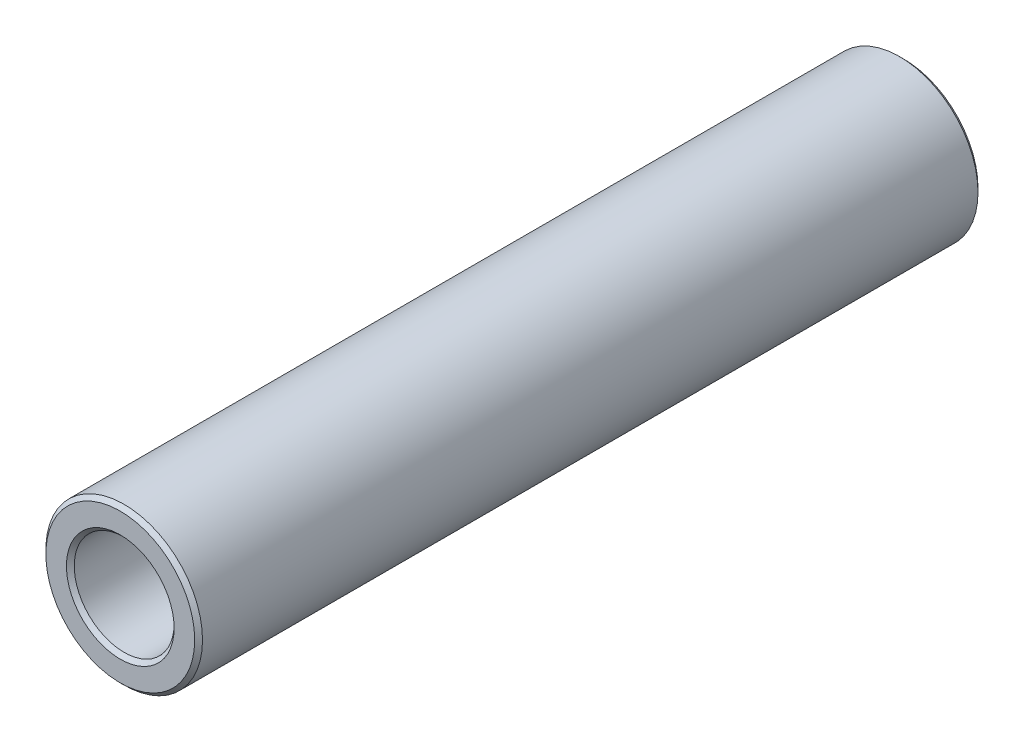
ISO-10303-21;
HEADER;
FILE_DESCRIPTION(('STEP AP214'),'2;1');
FILE_NAME('part.step','',(''),(''),'','','');
FILE_SCHEMA(('AUTOMOTIVE_DESIGN { 1 0 10303 214 1 1 1 1 }'));
ENDSEC;
DATA;
#1=APPLICATION_CONTEXT('core data for automotive mechanical design processes');
#2=APPLICATION_PROTOCOL_DEFINITION('international standard','automotive_design',2000,#1);
#3=PRODUCT_CONTEXT('',#1,'mechanical');
#4=PRODUCT('Part','Part','',(#3));
#5=PRODUCT_RELATED_PRODUCT_CATEGORY('part','',(#4));
#6=PRODUCT_DEFINITION_FORMATION('','',#4);
#7=PRODUCT_DEFINITION_CONTEXT('part definition',#1,'design');
#8=PRODUCT_DEFINITION('design','',#6,#7);
#9=PRODUCT_DEFINITION_SHAPE('','',#8);
#10=(LENGTH_UNIT() NAMED_UNIT(*) SI_UNIT(.MILLI.,.METRE.));
#11=(NAMED_UNIT(*) PLANE_ANGLE_UNIT() SI_UNIT($,.RADIAN.));
#12=(NAMED_UNIT(*) SI_UNIT($,.STERADIAN.) SOLID_ANGLE_UNIT());
#13=UNCERTAINTY_MEASURE_WITH_UNIT(LENGTH_MEASURE(1.E-05),#10,'distance_accuracy_value','');
#14=(GEOMETRIC_REPRESENTATION_CONTEXT(3) GLOBAL_UNCERTAINTY_ASSIGNED_CONTEXT((#13)) GLOBAL_UNIT_ASSIGNED_CONTEXT((#10,
#11,#12)) REPRESENTATION_CONTEXT('',''));
#15=CARTESIAN_POINT('',(0.,0.,0.));
#16=DIRECTION('',(0.,0.,1.));
#17=DIRECTION('',(1.,0.,0.));
#18=AXIS2_PLACEMENT_3D('',#15,#16,#17);
#19=CARTESIAN_POINT('',(0.,0.,40.));
#20=DIRECTION('',(0.,0.,1.));
#21=DIRECTION('',(1.,0.,0.));
#22=AXIS2_PLACEMENT_3D('',#19,#20,#21);
#23=PLANE('',#22);
#24=CARTESIAN_POINT('',(0.,0.,40.));
#25=DIRECTION('',(0.,0.,1.));
#26=DIRECTION('',(1.,0.,0.));
#27=AXIS2_PLACEMENT_3D('',#24,#25,#26);
#28=CIRCLE('',#27,2.75);
#29=CARTESIAN_POINT('',(2.75,0.,40.));
#30=VERTEX_POINT('',#29);
#31=EDGE_CURVE('E10',#30,#30,#28,.F.);
#32=ORIENTED_EDGE('',*,*,#31,.T.);
#33=EDGE_LOOP('',(#32));
#34=FACE_BOUND('',#33,.T.);
#35=CARTESIAN_POINT('',(0.,0.,40.));
#36=DIRECTION('',(0.,0.,1.));
#37=DIRECTION('',(1.,0.,0.));
#38=AXIS2_PLACEMENT_3D('',#35,#36,#37);
#39=CIRCLE('',#38,3.8);
#40=CARTESIAN_POINT('',(3.8,0.,40.));
#41=VERTEX_POINT('',#40);
#42=EDGE_CURVE('E44',#41,#41,#39,.T.);
#43=ORIENTED_EDGE('',*,*,#42,.T.);
#44=EDGE_LOOP('',(#43));
#45=FACE_BOUND('',#44,.T.);
#46=ADVANCED_FACE('F37',(#34,#45),#23,.T.);
#47=CARTESIAN_POINT('',(0.,0.,0.));
#48=DIRECTION('',(0.,0.,1.));
#49=DIRECTION('',(1.,0.,0.));
#50=AXIS2_PLACEMENT_3D('',#47,#48,#49);
#51=PLANE('',#50);
#52=CARTESIAN_POINT('',(0.,0.,0.));
#53=DIRECTION('',(0.,0.,1.));
#54=DIRECTION('',(1.,0.,0.));
#55=AXIS2_PLACEMENT_3D('',#52,#53,#54);
#56=CIRCLE('',#55,3.8);
#57=CARTESIAN_POINT('',(3.8,0.,0.));
#58=VERTEX_POINT('',#57);
#59=EDGE_CURVE('E57',#58,#58,#56,.F.);
#60=ORIENTED_EDGE('',*,*,#59,.T.);
#61=EDGE_LOOP('',(#60));
#62=FACE_BOUND('',#61,.T.);
#63=CARTESIAN_POINT('',(0.,0.,0.));
#64=DIRECTION('',(0.,0.,1.));
#65=DIRECTION('',(1.,0.,0.));
#66=AXIS2_PLACEMENT_3D('',#63,#64,#65);
#67=CIRCLE('',#66,2.75);
#68=CARTESIAN_POINT('',(2.75,0.,0.));
#69=VERTEX_POINT('',#68);
#70=EDGE_CURVE('E60',#69,#69,#67,.T.);
#71=ORIENTED_EDGE('',*,*,#70,.T.);
#72=EDGE_LOOP('',(#71));
#73=FACE_BOUND('',#72,.T.);
#74=ADVANCED_FACE('F81',(#62,#73),#51,.F.);
#75=CARTESIAN_POINT('',(0.,0.,40.));
#76=DIRECTION('',(0.,0.,-1.));
#77=DIRECTION('',(-1.,0.,0.));
#78=AXIS2_PLACEMENT_3D('',#75,#76,#77);
#79=CYLINDRICAL_SURFACE('',#78,4.);
#80=CARTESIAN_POINT('',(0.,0.,0.199999999999999));
#81=DIRECTION('',(0.,0.,1.));
#82=DIRECTION('',(1.,0.,0.));
#83=AXIS2_PLACEMENT_3D('',#80,#81,#82);
#84=CIRCLE('',#83,4.);
#85=CARTESIAN_POINT('',(4.,0.,0.199999999999999));
#86=VERTEX_POINT('',#85);
#87=EDGE_CURVE('E63',#86,#86,#84,.T.);
#88=ORIENTED_EDGE('',*,*,#87,.T.);
#89=EDGE_LOOP('',(#88));
#90=FACE_BOUND('',#89,.T.);
#91=CARTESIAN_POINT('',(0.,0.,39.8));
#92=DIRECTION('',(0.,0.,1.));
#93=DIRECTION('',(1.,0.,0.));
#94=AXIS2_PLACEMENT_3D('',#91,#92,#93);
#95=CIRCLE('',#94,4.);
#96=CARTESIAN_POINT('',(4.,0.,39.8));
#97=VERTEX_POINT('',#96);
#98=EDGE_CURVE('E66',#97,#97,#95,.F.);
#99=ORIENTED_EDGE('',*,*,#98,.T.);
#100=EDGE_LOOP('',(#99));
#101=FACE_BOUND('',#100,.T.);
#102=ADVANCED_FACE('F70',(#90,#101),#79,.T.);
#103=CARTESIAN_POINT('',(0.,0.,40.));
#104=DIRECTION('',(0.,0.,-1.));
#105=DIRECTION('',(-1.,0.,0.));
#106=AXIS2_PLACEMENT_3D('',#103,#104,#105);
#107=CYLINDRICAL_SURFACE('',#106,2.55);
#108=CARTESIAN_POINT('',(0.,0.,0.199999999999999));
#109=DIRECTION('',(0.,0.,1.));
#110=DIRECTION('',(1.,0.,0.));
#111=AXIS2_PLACEMENT_3D('',#108,#109,#110);
#112=CIRCLE('',#111,2.55);
#113=CARTESIAN_POINT('',(2.55,0.,0.199999999999999));
#114=VERTEX_POINT('',#113);
#115=EDGE_CURVE('E48',#114,#114,#112,.F.);
#116=ORIENTED_EDGE('',*,*,#115,.T.);
#117=EDGE_LOOP('',(#116));
#118=FACE_BOUND('',#117,.T.);
#119=CARTESIAN_POINT('',(0.,0.,39.8));
#120=DIRECTION('',(0.,0.,1.));
#121=DIRECTION('',(1.,0.,0.));
#122=AXIS2_PLACEMENT_3D('',#119,#120,#121);
#123=CIRCLE('',#122,2.55);
#124=CARTESIAN_POINT('',(2.55,0.,39.8));
#125=VERTEX_POINT('',#124);
#126=EDGE_CURVE('E52',#125,#125,#123,.T.);
#127=ORIENTED_EDGE('',*,*,#126,.T.);
#128=EDGE_LOOP('',(#127));
#129=FACE_BOUND('',#128,.T.);
#130=ADVANCED_FACE('F89',(#118,#129),#107,.F.);
#131=CARTESIAN_POINT('',(0.,0.,0.199999999999999));
#132=DIRECTION('',(0.,0.,1.));
#133=DIRECTION('',(1.,0.,0.));
#134=AXIS2_PLACEMENT_3D('',#131,#132,#133);
#135=CONICAL_SURFACE('',#134,4.,0.785398163397457);
#136=ORIENTED_EDGE('',*,*,#59,.F.);
#137=EDGE_LOOP('',(#136));
#138=FACE_BOUND('',#137,.T.);
#139=ORIENTED_EDGE('',*,*,#87,.F.);
#140=EDGE_LOOP('',(#139));
#141=FACE_BOUND('',#140,.T.);
#142=ADVANCED_FACE('F94',(#138,#141),#135,.T.);
#143=CARTESIAN_POINT('',(0.,0.,0.));
#144=DIRECTION('',(0.,0.,-1.));
#145=DIRECTION('',(-1.,0.,0.));
#146=AXIS2_PLACEMENT_3D('',#143,#144,#145);
#147=CONICAL_SURFACE('',#146,2.75,0.785398163397449);
#148=ORIENTED_EDGE('',*,*,#115,.F.);
#149=EDGE_LOOP('',(#148));
#150=FACE_BOUND('',#149,.T.);
#151=ORIENTED_EDGE('',*,*,#70,.F.);
#152=EDGE_LOOP('',(#151));
#153=FACE_BOUND('',#152,.T.);
#154=ADVANCED_FACE('F78',(#150,#153),#147,.F.);
#155=CARTESIAN_POINT('',(0.,0.,39.8));
#156=DIRECTION('',(0.,0.,1.));
#157=DIRECTION('',(1.,0.,0.));
#158=AXIS2_PLACEMENT_3D('',#155,#156,#157);
#159=CONICAL_SURFACE('',#158,2.55,0.785398163397449);
#160=ORIENTED_EDGE('',*,*,#31,.F.);
#161=EDGE_LOOP('',(#160));
#162=FACE_BOUND('',#161,.T.);
#163=ORIENTED_EDGE('',*,*,#126,.F.);
#164=EDGE_LOOP('',(#163));
#165=FACE_BOUND('',#164,.T.);
#166=ADVANCED_FACE('F74',(#162,#165),#159,.F.);
#167=CARTESIAN_POINT('',(0.,0.,40.));
#168=DIRECTION('',(0.,0.,-1.));
#169=DIRECTION('',(-1.,0.,0.));
#170=AXIS2_PLACEMENT_3D('',#167,#168,#169);
#171=CONICAL_SURFACE('',#170,3.8,0.785398163397448);
#172=ORIENTED_EDGE('',*,*,#98,.F.);
#173=EDGE_LOOP('',(#172));
#174=FACE_BOUND('',#173,.T.);
#175=ORIENTED_EDGE('',*,*,#42,.F.);
#176=EDGE_LOOP('',(#175));
#177=FACE_BOUND('',#176,.T.);
#178=ADVANCED_FACE('F39',(#174,#177),#171,.T.);
#179=CLOSED_SHELL('',(#46,#74,#102,#130,#142,#154,#166,#178));
#180=MANIFOLD_SOLID_BREP('B2',#179);
#181=ADVANCED_BREP_SHAPE_REPRESENTATION('',(#18,#180),#14);
#182=SHAPE_DEFINITION_REPRESENTATION(#9,#181);
ENDSEC;
END-ISO-10303-21;
